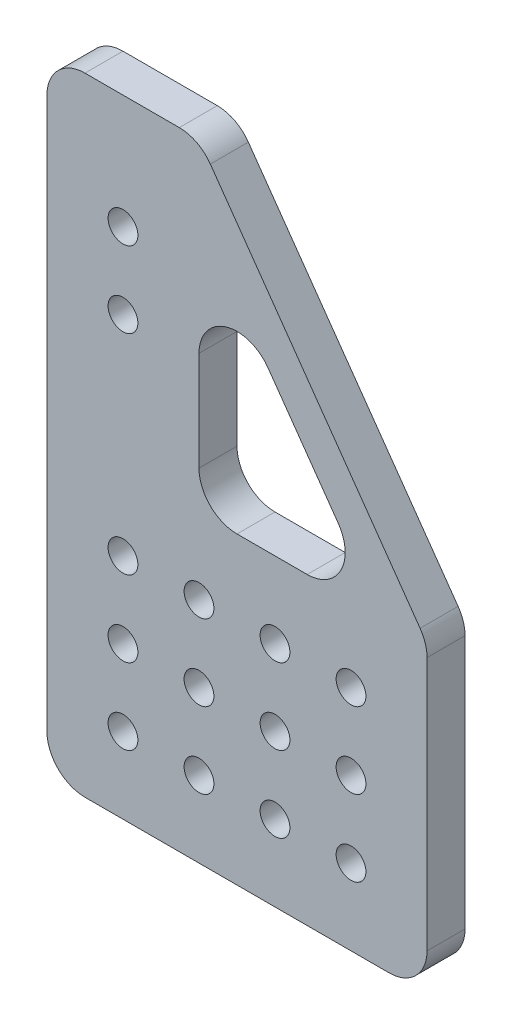
ISO-10303-21;
HEADER;
FILE_DESCRIPTION(('STEP AP214'),'2;1');
FILE_NAME('part.step','',(''),(''),'','','');
FILE_SCHEMA(('AUTOMOTIVE_DESIGN { 1 0 10303 214 1 1 1 1 }'));
ENDSEC;
DATA;
#1=APPLICATION_CONTEXT('core data for automotive mechanical design processes');
#2=APPLICATION_PROTOCOL_DEFINITION('international standard','automotive_design',2000,#1);
#3=PRODUCT_CONTEXT('',#1,'mechanical');
#4=PRODUCT('Part','Part','',(#3));
#5=PRODUCT_RELATED_PRODUCT_CATEGORY('part','',(#4));
#6=PRODUCT_DEFINITION_FORMATION('','',#4);
#7=PRODUCT_DEFINITION_CONTEXT('part definition',#1,'design');
#8=PRODUCT_DEFINITION('design','',#6,#7);
#9=PRODUCT_DEFINITION_SHAPE('','',#8);
#10=(LENGTH_UNIT() NAMED_UNIT(*) SI_UNIT(.MILLI.,.METRE.));
#11=(NAMED_UNIT(*) PLANE_ANGLE_UNIT() SI_UNIT($,.RADIAN.));
#12=(NAMED_UNIT(*) SI_UNIT($,.STERADIAN.) SOLID_ANGLE_UNIT());
#13=UNCERTAINTY_MEASURE_WITH_UNIT(LENGTH_MEASURE(1.E-05),#10,'distance_accuracy_value','');
#14=(GEOMETRIC_REPRESENTATION_CONTEXT(3) GLOBAL_UNCERTAINTY_ASSIGNED_CONTEXT((#13)) GLOBAL_UNIT_ASSIGNED_CONTEXT((#10,
#11,#12)) REPRESENTATION_CONTEXT('',''));
#15=CARTESIAN_POINT('',(0.,0.,0.));
#16=DIRECTION('',(0.,0.,1.));
#17=DIRECTION('',(1.,0.,0.));
#18=AXIS2_PLACEMENT_3D('',#15,#16,#17);
#19=CARTESIAN_POINT('',(50.8,38.1,3.175));
#20=DIRECTION('',(0.,0.,-1.));
#21=DIRECTION('',(-1.,0.,0.));
#22=AXIS2_PLACEMENT_3D('',#19,#20,#21);
#23=CYLINDRICAL_SURFACE('',#22,2.4892);
#24=CARTESIAN_POINT('',(50.8,38.1,3.175));
#25=DIRECTION('',(0.,0.,1.));
#26=DIRECTION('',(1.,0.,0.));
#27=AXIS2_PLACEMENT_3D('',#24,#25,#26);
#28=CIRCLE('',#27,2.4892);
#29=CARTESIAN_POINT('',(53.2892,38.1,3.175));
#30=VERTEX_POINT('',#29);
#31=EDGE_CURVE('E285',#30,#30,#28,.T.);
#32=ORIENTED_EDGE('',*,*,#31,.T.);
#33=EDGE_LOOP('',(#32));
#34=FACE_BOUND('',#33,.T.);
#35=CARTESIAN_POINT('',(50.8,38.1,-3.175));
#36=DIRECTION('',(0.,0.,1.));
#37=DIRECTION('',(1.,0.,0.));
#38=AXIS2_PLACEMENT_3D('',#35,#36,#37);
#39=CIRCLE('',#38,2.4892);
#40=CARTESIAN_POINT('',(53.2892,38.1,-3.175));
#41=VERTEX_POINT('',#40);
#42=EDGE_CURVE('E289',#41,#41,#39,.T.);
#43=ORIENTED_EDGE('',*,*,#42,.F.);
#44=EDGE_LOOP('',(#43));
#45=FACE_BOUND('',#44,.T.);
#46=ADVANCED_FACE('F38',(#34,#45),#23,.F.);
#47=CARTESIAN_POINT('',(38.1,38.1,3.175));
#48=DIRECTION('',(0.,0.,-1.));
#49=DIRECTION('',(-1.,0.,0.));
#50=AXIS2_PLACEMENT_3D('',#47,#48,#49);
#51=CYLINDRICAL_SURFACE('',#50,2.4892);
#52=CARTESIAN_POINT('',(38.1,38.1,3.175));
#53=DIRECTION('',(0.,0.,1.));
#54=DIRECTION('',(1.,0.,0.));
#55=AXIS2_PLACEMENT_3D('',#52,#53,#54);
#56=CIRCLE('',#55,2.4892);
#57=CARTESIAN_POINT('',(40.5892,38.1,3.175));
#58=VERTEX_POINT('',#57);
#59=EDGE_CURVE('E277',#58,#58,#56,.T.);
#60=ORIENTED_EDGE('',*,*,#59,.T.);
#61=EDGE_LOOP('',(#60));
#62=FACE_BOUND('',#61,.T.);
#63=CARTESIAN_POINT('',(38.1,38.1,-3.175));
#64=DIRECTION('',(0.,0.,1.));
#65=DIRECTION('',(1.,0.,0.));
#66=AXIS2_PLACEMENT_3D('',#63,#64,#65);
#67=CIRCLE('',#66,2.4892);
#68=CARTESIAN_POINT('',(40.5892,38.1,-3.175));
#69=VERTEX_POINT('',#68);
#70=EDGE_CURVE('E281',#69,#69,#67,.T.);
#71=ORIENTED_EDGE('',*,*,#70,.F.);
#72=EDGE_LOOP('',(#71));
#73=FACE_BOUND('',#72,.T.);
#74=ADVANCED_FACE('F496',(#62,#73),#51,.F.);
#75=CARTESIAN_POINT('',(25.4,38.1,3.175));
#76=DIRECTION('',(0.,0.,-1.));
#77=DIRECTION('',(-1.,0.,0.));
#78=AXIS2_PLACEMENT_3D('',#75,#76,#77);
#79=CYLINDRICAL_SURFACE('',#78,2.4892);
#80=CARTESIAN_POINT('',(25.4,38.1,3.175));
#81=DIRECTION('',(0.,0.,1.));
#82=DIRECTION('',(1.,0.,0.));
#83=AXIS2_PLACEMENT_3D('',#80,#81,#82);
#84=CIRCLE('',#83,2.4892);
#85=CARTESIAN_POINT('',(27.8892,38.1,3.175));
#86=VERTEX_POINT('',#85);
#87=EDGE_CURVE('E269',#86,#86,#84,.T.);
#88=ORIENTED_EDGE('',*,*,#87,.T.);
#89=EDGE_LOOP('',(#88));
#90=FACE_BOUND('',#89,.T.);
#91=CARTESIAN_POINT('',(25.4,38.1,-3.175));
#92=DIRECTION('',(0.,0.,1.));
#93=DIRECTION('',(1.,0.,0.));
#94=AXIS2_PLACEMENT_3D('',#91,#92,#93);
#95=CIRCLE('',#94,2.4892);
#96=CARTESIAN_POINT('',(27.8892,38.1,-3.175));
#97=VERTEX_POINT('',#96);
#98=EDGE_CURVE('E273',#97,#97,#95,.T.);
#99=ORIENTED_EDGE('',*,*,#98,.F.);
#100=EDGE_LOOP('',(#99));
#101=FACE_BOUND('',#100,.T.);
#102=ADVANCED_FACE('F502',(#90,#101),#79,.F.);
#103=CARTESIAN_POINT('',(12.7,38.1,3.175));
#104=DIRECTION('',(0.,0.,-1.));
#105=DIRECTION('',(-1.,0.,0.));
#106=AXIS2_PLACEMENT_3D('',#103,#104,#105);
#107=CYLINDRICAL_SURFACE('',#106,2.4892);
#108=CARTESIAN_POINT('',(12.7,38.1,3.175));
#109=DIRECTION('',(0.,0.,1.));
#110=DIRECTION('',(1.,0.,0.));
#111=AXIS2_PLACEMENT_3D('',#108,#109,#110);
#112=CIRCLE('',#111,2.4892);
#113=CARTESIAN_POINT('',(15.1892,38.1,3.175));
#114=VERTEX_POINT('',#113);
#115=EDGE_CURVE('E261',#114,#114,#112,.T.);
#116=ORIENTED_EDGE('',*,*,#115,.T.);
#117=EDGE_LOOP('',(#116));
#118=FACE_BOUND('',#117,.T.);
#119=CARTESIAN_POINT('',(12.7,38.1,-3.175));
#120=DIRECTION('',(0.,0.,1.));
#121=DIRECTION('',(1.,0.,0.));
#122=AXIS2_PLACEMENT_3D('',#119,#120,#121);
#123=CIRCLE('',#122,2.4892);
#124=CARTESIAN_POINT('',(15.1892,38.1,-3.175));
#125=VERTEX_POINT('',#124);
#126=EDGE_CURVE('E265',#125,#125,#123,.T.);
#127=ORIENTED_EDGE('',*,*,#126,.F.);
#128=EDGE_LOOP('',(#127));
#129=FACE_BOUND('',#128,.T.);
#130=ADVANCED_FACE('F509',(#118,#129),#107,.F.);
#131=CARTESIAN_POINT('',(50.8,25.4,3.175));
#132=DIRECTION('',(0.,0.,-1.));
#133=DIRECTION('',(-1.,0.,0.));
#134=AXIS2_PLACEMENT_3D('',#131,#132,#133);
#135=CYLINDRICAL_SURFACE('',#134,2.4892);
#136=CARTESIAN_POINT('',(50.8,25.4,3.175));
#137=DIRECTION('',(0.,0.,1.));
#138=DIRECTION('',(1.,0.,0.));
#139=AXIS2_PLACEMENT_3D('',#136,#137,#138);
#140=CIRCLE('',#139,2.4892);
#141=CARTESIAN_POINT('',(53.2892,25.4,3.175));
#142=VERTEX_POINT('',#141);
#143=EDGE_CURVE('E253',#142,#142,#140,.T.);
#144=ORIENTED_EDGE('',*,*,#143,.T.);
#145=EDGE_LOOP('',(#144));
#146=FACE_BOUND('',#145,.T.);
#147=CARTESIAN_POINT('',(50.8,25.4,-3.175));
#148=DIRECTION('',(0.,0.,1.));
#149=DIRECTION('',(1.,0.,0.));
#150=AXIS2_PLACEMENT_3D('',#147,#148,#149);
#151=CIRCLE('',#150,2.4892);
#152=CARTESIAN_POINT('',(53.2892,25.4,-3.175));
#153=VERTEX_POINT('',#152);
#154=EDGE_CURVE('E257',#153,#153,#151,.T.);
#155=ORIENTED_EDGE('',*,*,#154,.F.);
#156=EDGE_LOOP('',(#155));
#157=FACE_BOUND('',#156,.T.);
#158=ADVANCED_FACE('F513',(#146,#157),#135,.F.);
#159=CARTESIAN_POINT('',(38.1,25.4,3.175));
#160=DIRECTION('',(0.,0.,-1.));
#161=DIRECTION('',(-1.,0.,0.));
#162=AXIS2_PLACEMENT_3D('',#159,#160,#161);
#163=CYLINDRICAL_SURFACE('',#162,2.4892);
#164=CARTESIAN_POINT('',(38.1,25.4,3.175));
#165=DIRECTION('',(0.,0.,1.));
#166=DIRECTION('',(1.,0.,0.));
#167=AXIS2_PLACEMENT_3D('',#164,#165,#166);
#168=CIRCLE('',#167,2.4892);
#169=CARTESIAN_POINT('',(40.5892,25.4,3.175));
#170=VERTEX_POINT('',#169);
#171=EDGE_CURVE('E245',#170,#170,#168,.T.);
#172=ORIENTED_EDGE('',*,*,#171,.T.);
#173=EDGE_LOOP('',(#172));
#174=FACE_BOUND('',#173,.T.);
#175=CARTESIAN_POINT('',(38.1,25.4,-3.175));
#176=DIRECTION('',(0.,0.,1.));
#177=DIRECTION('',(1.,0.,0.));
#178=AXIS2_PLACEMENT_3D('',#175,#176,#177);
#179=CIRCLE('',#178,2.4892);
#180=CARTESIAN_POINT('',(40.5892,25.4,-3.175));
#181=VERTEX_POINT('',#180);
#182=EDGE_CURVE('E249',#181,#181,#179,.T.);
#183=ORIENTED_EDGE('',*,*,#182,.F.);
#184=EDGE_LOOP('',(#183));
#185=FACE_BOUND('',#184,.T.);
#186=ADVANCED_FACE('F517',(#174,#185),#163,.F.);
#187=CARTESIAN_POINT('',(25.4,25.4,3.175));
#188=DIRECTION('',(0.,0.,-1.));
#189=DIRECTION('',(-1.,0.,0.));
#190=AXIS2_PLACEMENT_3D('',#187,#188,#189);
#191=CYLINDRICAL_SURFACE('',#190,2.4892);
#192=CARTESIAN_POINT('',(25.4,25.4,3.175));
#193=DIRECTION('',(0.,0.,1.));
#194=DIRECTION('',(1.,0.,0.));
#195=AXIS2_PLACEMENT_3D('',#192,#193,#194);
#196=CIRCLE('',#195,2.4892);
#197=CARTESIAN_POINT('',(27.8892,25.4,3.175));
#198=VERTEX_POINT('',#197);
#199=EDGE_CURVE('E237',#198,#198,#196,.T.);
#200=ORIENTED_EDGE('',*,*,#199,.T.);
#201=EDGE_LOOP('',(#200));
#202=FACE_BOUND('',#201,.T.);
#203=CARTESIAN_POINT('',(25.4,25.4,-3.175));
#204=DIRECTION('',(0.,0.,1.));
#205=DIRECTION('',(1.,0.,0.));
#206=AXIS2_PLACEMENT_3D('',#203,#204,#205);
#207=CIRCLE('',#206,2.4892);
#208=CARTESIAN_POINT('',(27.8892,25.4,-3.175));
#209=VERTEX_POINT('',#208);
#210=EDGE_CURVE('E241',#209,#209,#207,.T.);
#211=ORIENTED_EDGE('',*,*,#210,.F.);
#212=EDGE_LOOP('',(#211));
#213=FACE_BOUND('',#212,.T.);
#214=ADVANCED_FACE('F521',(#202,#213),#191,.F.);
#215=CARTESIAN_POINT('',(12.7,25.4,3.175));
#216=DIRECTION('',(0.,0.,-1.));
#217=DIRECTION('',(-1.,0.,0.));
#218=AXIS2_PLACEMENT_3D('',#215,#216,#217);
#219=CYLINDRICAL_SURFACE('',#218,2.4892);
#220=CARTESIAN_POINT('',(12.7,25.4,3.175));
#221=DIRECTION('',(0.,0.,1.));
#222=DIRECTION('',(1.,0.,0.));
#223=AXIS2_PLACEMENT_3D('',#220,#221,#222);
#224=CIRCLE('',#223,2.4892);
#225=CARTESIAN_POINT('',(15.1892,25.4,3.175));
#226=VERTEX_POINT('',#225);
#227=EDGE_CURVE('E229',#226,#226,#224,.T.);
#228=ORIENTED_EDGE('',*,*,#227,.T.);
#229=EDGE_LOOP('',(#228));
#230=FACE_BOUND('',#229,.T.);
#231=CARTESIAN_POINT('',(12.7,25.4,-3.175));
#232=DIRECTION('',(0.,0.,1.));
#233=DIRECTION('',(1.,0.,0.));
#234=AXIS2_PLACEMENT_3D('',#231,#232,#233);
#235=CIRCLE('',#234,2.4892);
#236=CARTESIAN_POINT('',(15.1892,25.4,-3.175));
#237=VERTEX_POINT('',#236);
#238=EDGE_CURVE('E233',#237,#237,#235,.T.);
#239=ORIENTED_EDGE('',*,*,#238,.F.);
#240=EDGE_LOOP('',(#239));
#241=FACE_BOUND('',#240,.T.);
#242=ADVANCED_FACE('F525',(#230,#241),#219,.F.);
#243=CARTESIAN_POINT('',(50.8,12.7,3.175));
#244=DIRECTION('',(0.,0.,-1.));
#245=DIRECTION('',(-1.,0.,0.));
#246=AXIS2_PLACEMENT_3D('',#243,#244,#245);
#247=CYLINDRICAL_SURFACE('',#246,2.4892);
#248=CARTESIAN_POINT('',(50.8,12.7,3.175));
#249=DIRECTION('',(0.,0.,1.));
#250=DIRECTION('',(1.,0.,0.));
#251=AXIS2_PLACEMENT_3D('',#248,#249,#250);
#252=CIRCLE('',#251,2.4892);
#253=CARTESIAN_POINT('',(53.2892,12.7,3.175));
#254=VERTEX_POINT('',#253);
#255=EDGE_CURVE('E221',#254,#254,#252,.T.);
#256=ORIENTED_EDGE('',*,*,#255,.T.);
#257=EDGE_LOOP('',(#256));
#258=FACE_BOUND('',#257,.T.);
#259=CARTESIAN_POINT('',(50.8,12.7,-3.175));
#260=DIRECTION('',(0.,0.,1.));
#261=DIRECTION('',(1.,0.,0.));
#262=AXIS2_PLACEMENT_3D('',#259,#260,#261);
#263=CIRCLE('',#262,2.4892);
#264=CARTESIAN_POINT('',(53.2892,12.7,-3.175));
#265=VERTEX_POINT('',#264);
#266=EDGE_CURVE('E225',#265,#265,#263,.T.);
#267=ORIENTED_EDGE('',*,*,#266,.F.);
#268=EDGE_LOOP('',(#267));
#269=FACE_BOUND('',#268,.T.);
#270=ADVANCED_FACE('F529',(#258,#269),#247,.F.);
#271=CARTESIAN_POINT('',(38.1,12.7,3.175));
#272=DIRECTION('',(0.,0.,-1.));
#273=DIRECTION('',(-1.,0.,0.));
#274=AXIS2_PLACEMENT_3D('',#271,#272,#273);
#275=CYLINDRICAL_SURFACE('',#274,2.4892);
#276=CARTESIAN_POINT('',(38.1,12.7,3.175));
#277=DIRECTION('',(0.,0.,1.));
#278=DIRECTION('',(1.,0.,0.));
#279=AXIS2_PLACEMENT_3D('',#276,#277,#278);
#280=CIRCLE('',#279,2.4892);
#281=CARTESIAN_POINT('',(40.5892,12.7,3.175));
#282=VERTEX_POINT('',#281);
#283=EDGE_CURVE('E213',#282,#282,#280,.T.);
#284=ORIENTED_EDGE('',*,*,#283,.T.);
#285=EDGE_LOOP('',(#284));
#286=FACE_BOUND('',#285,.T.);
#287=CARTESIAN_POINT('',(38.1,12.7,-3.175));
#288=DIRECTION('',(0.,0.,1.));
#289=DIRECTION('',(1.,0.,0.));
#290=AXIS2_PLACEMENT_3D('',#287,#288,#289);
#291=CIRCLE('',#290,2.4892);
#292=CARTESIAN_POINT('',(40.5892,12.7,-3.175));
#293=VERTEX_POINT('',#292);
#294=EDGE_CURVE('E217',#293,#293,#291,.T.);
#295=ORIENTED_EDGE('',*,*,#294,.F.);
#296=EDGE_LOOP('',(#295));
#297=FACE_BOUND('',#296,.T.);
#298=ADVANCED_FACE('F533',(#286,#297),#275,.F.);
#299=CARTESIAN_POINT('',(25.4,12.7,3.175));
#300=DIRECTION('',(0.,0.,-1.));
#301=DIRECTION('',(-1.,0.,0.));
#302=AXIS2_PLACEMENT_3D('',#299,#300,#301);
#303=CYLINDRICAL_SURFACE('',#302,2.4892);
#304=CARTESIAN_POINT('',(25.4,12.7,3.175));
#305=DIRECTION('',(0.,0.,1.));
#306=DIRECTION('',(1.,0.,0.));
#307=AXIS2_PLACEMENT_3D('',#304,#305,#306);
#308=CIRCLE('',#307,2.4892);
#309=CARTESIAN_POINT('',(27.8892,12.7,3.175));
#310=VERTEX_POINT('',#309);
#311=EDGE_CURVE('E204',#310,#310,#308,.T.);
#312=ORIENTED_EDGE('',*,*,#311,.T.);
#313=EDGE_LOOP('',(#312));
#314=FACE_BOUND('',#313,.T.);
#315=CARTESIAN_POINT('',(25.4,12.7,-3.175));
#316=DIRECTION('',(0.,0.,1.));
#317=DIRECTION('',(1.,0.,0.));
#318=AXIS2_PLACEMENT_3D('',#315,#316,#317);
#319=CIRCLE('',#318,2.4892);
#320=CARTESIAN_POINT('',(27.8892,12.7,-3.175));
#321=VERTEX_POINT('',#320);
#322=EDGE_CURVE('E208',#321,#321,#319,.T.);
#323=ORIENTED_EDGE('',*,*,#322,.F.);
#324=EDGE_LOOP('',(#323));
#325=FACE_BOUND('',#324,.T.);
#326=ADVANCED_FACE('F537',(#314,#325),#303,.F.);
#327=CARTESIAN_POINT('',(0.,0.,3.175));
#328=DIRECTION('',(0.,0.,-1.));
#329=DIRECTION('',(-1.,0.,0.));
#330=AXIS2_PLACEMENT_3D('',#327,#328,#329);
#331=PLANE('',#330);
#332=DIRECTION('',(-0.576683197598655,0.816967863264761,0.));
#333=VECTOR('',#332,1.);
#334=CARTESIAN_POINT('',(55.7273564413854,50.8,3.175));
#335=LINE('',#334,#333);
#336=CARTESIAN_POINT('',(48.6601058733255,60.8119383047515,3.175));
#337=VERTEX_POINT('',#336);
#338=CARTESIAN_POINT('',(36.9377459317312,77.4186148886767,3.175));
#339=VERTEX_POINT('',#338);
#340=EDGE_CURVE('E398',#337,#339,#335,.T.);
#341=ORIENTED_EDGE('',*,*,#340,.F.);
#342=CARTESIAN_POINT('',(43.4723599415943,57.15,3.175));
#343=DIRECTION('',(0.,0.,-1.));
#344=DIRECTION('',(-1.,0.,0.));
#345=AXIS2_PLACEMENT_3D('',#342,#343,#344);
#346=CIRCLE('',#345,6.35);
#347=CARTESIAN_POINT('',(43.4723599415943,50.8,3.175));
#348=VERTEX_POINT('',#347);
#349=EDGE_CURVE('E371',#337,#348,#346,.T.);
#350=ORIENTED_EDGE('',*,*,#349,.T.);
#351=DIRECTION('',(1.,0.,0.));
#352=VECTOR('',#351,1.);
#353=CARTESIAN_POINT('',(25.4,50.8,3.175));
#354=LINE('',#353,#352);
#355=CARTESIAN_POINT('',(31.75,50.8,3.175));
#356=VERTEX_POINT('',#355);
#357=EDGE_CURVE('E387',#356,#348,#354,.T.);
#358=ORIENTED_EDGE('',*,*,#357,.F.);
#359=CARTESIAN_POINT('',(31.75,57.15,3.175));
#360=DIRECTION('',(0.,0.,-1.));
#361=DIRECTION('',(-1.,0.,0.));
#362=AXIS2_PLACEMENT_3D('',#359,#360,#361);
#363=CIRCLE('',#362,6.35);
#364=CARTESIAN_POINT('',(25.4,57.15,3.175));
#365=VERTEX_POINT('',#364);
#366=EDGE_CURVE('E47',#356,#365,#363,.T.);
#367=ORIENTED_EDGE('',*,*,#366,.T.);
#368=DIRECTION('',(0.,-1.,0.));
#369=VECTOR('',#368,1.);
#370=CARTESIAN_POINT('',(25.4,93.7637549586293,3.175));
#371=LINE('',#370,#369);
#372=CARTESIAN_POINT('',(25.4,73.7566765839252,3.175));
#373=VERTEX_POINT('',#372);
#374=EDGE_CURVE('E385',#373,#365,#371,.T.);
#375=ORIENTED_EDGE('',*,*,#374,.F.);
#376=CARTESIAN_POINT('',(31.75,73.7566765839252,3.175));
#377=DIRECTION('',(0.,0.,-1.));
#378=DIRECTION('',(-1.,0.,0.));
#379=AXIS2_PLACEMENT_3D('',#376,#377,#378);
#380=CIRCLE('',#379,6.35);
#381=EDGE_CURVE('E365',#373,#339,#380,.T.);
#382=ORIENTED_EDGE('',*,*,#381,.T.);
#383=EDGE_LOOP('',(#341,#350,#358,#367,#375,#382));
#384=FACE_BOUND('',#383,.T.);
#385=ORIENTED_EDGE('',*,*,#31,.F.);
#386=EDGE_LOOP('',(#385));
#387=FACE_BOUND('',#386,.T.);
#388=ORIENTED_EDGE('',*,*,#59,.F.);
#389=EDGE_LOOP('',(#388));
#390=FACE_BOUND('',#389,.T.);
#391=ORIENTED_EDGE('',*,*,#87,.F.);
#392=EDGE_LOOP('',(#391));
#393=FACE_BOUND('',#392,.T.);
#394=ORIENTED_EDGE('',*,*,#115,.F.);
#395=EDGE_LOOP('',(#394));
#396=FACE_BOUND('',#395,.T.);
#397=ORIENTED_EDGE('',*,*,#143,.F.);
#398=EDGE_LOOP('',(#397));
#399=FACE_BOUND('',#398,.T.);
#400=ORIENTED_EDGE('',*,*,#171,.F.);
#401=EDGE_LOOP('',(#400));
#402=FACE_BOUND('',#401,.T.);
#403=ORIENTED_EDGE('',*,*,#199,.F.);
#404=EDGE_LOOP('',(#403));
#405=FACE_BOUND('',#404,.T.);
#406=ORIENTED_EDGE('',*,*,#227,.F.);
#407=EDGE_LOOP('',(#406));
#408=FACE_BOUND('',#407,.T.);
#409=ORIENTED_EDGE('',*,*,#255,.F.);
#410=EDGE_LOOP('',(#409));
#411=FACE_BOUND('',#410,.T.);
#412=ORIENTED_EDGE('',*,*,#283,.F.);
#413=EDGE_LOOP('',(#412));
#414=FACE_BOUND('',#413,.T.);
#415=ORIENTED_EDGE('',*,*,#311,.F.);
#416=EDGE_LOOP('',(#415));
#417=FACE_BOUND('',#416,.T.);
#418=DIRECTION('',(1.,0.,0.));
#419=VECTOR('',#418,1.);
#420=CARTESIAN_POINT('',(63.5,0.,3.175));
#421=LINE('',#420,#419);
#422=CARTESIAN_POINT('',(6.35,0.,3.175));
#423=VERTEX_POINT('',#422);
#424=CARTESIAN_POINT('',(57.15,0.,3.175));
#425=VERTEX_POINT('',#424);
#426=EDGE_CURVE('E203',#423,#425,#421,.T.);
#427=ORIENTED_EDGE('',*,*,#426,.T.);
#428=CARTESIAN_POINT('',(57.15,6.35,3.175));
#429=DIRECTION('',(0.,0.,-1.));
#430=DIRECTION('',(-1.,0.,0.));
#431=AXIS2_PLACEMENT_3D('',#428,#429,#430);
#432=CIRCLE('',#431,6.35);
#433=CARTESIAN_POINT('',(63.5,6.35,3.175));
#434=VERTEX_POINT('',#433);
#435=EDGE_CURVE('E321',#425,#434,#432,.F.);
#436=ORIENTED_EDGE('',*,*,#435,.T.);
#437=DIRECTION('',(0.,1.,0.));
#438=VECTOR('',#437,1.);
#439=CARTESIAN_POINT('',(63.5,50.8,3.175));
#440=LINE('',#439,#438);
#441=CARTESIAN_POINT('',(63.5,48.7845882919626,3.175));
#442=VERTEX_POINT('',#441);
#443=EDGE_CURVE('E174',#434,#442,#440,.T.);
#444=ORIENTED_EDGE('',*,*,#443,.T.);
#445=CARTESIAN_POINT('',(57.15,48.7845882919626,3.175));
#446=DIRECTION('',(0.,0.,-1.));
#447=DIRECTION('',(-1.,0.,0.));
#448=AXIS2_PLACEMENT_3D('',#445,#446,#447);
#449=CIRCLE('',#448,6.35);
#450=CARTESIAN_POINT('',(62.3377459317312,52.4465265967141,3.175));
#451=VERTEX_POINT('',#450);
#452=EDGE_CURVE('E318',#442,#451,#449,.F.);
#453=ORIENTED_EDGE('',*,*,#452,.T.);
#454=DIRECTION('',(-0.576683197598655,0.816967863264762,0.));
#455=VECTOR('',#454,1.);
#456=CARTESIAN_POINT('',(25.4,104.775,3.175));
#457=LINE('',#456,#455);
#458=CARTESIAN_POINT('',(27.2974553142931,102.086938304751,3.175));
#459=VERTEX_POINT('',#458);
#460=EDGE_CURVE('E449',#451,#459,#457,.T.);
#461=ORIENTED_EDGE('',*,*,#460,.T.);
#462=CARTESIAN_POINT('',(22.1097093825618,98.425,3.175));
#463=DIRECTION('',(0.,0.,-1.));
#464=DIRECTION('',(-1.,0.,0.));
#465=AXIS2_PLACEMENT_3D('',#462,#463,#464);
#466=CIRCLE('',#465,6.35);
#467=CARTESIAN_POINT('',(22.1097093825618,104.775,3.175));
#468=VERTEX_POINT('',#467);
#469=EDGE_CURVE('E315',#459,#468,#466,.F.);
#470=ORIENTED_EDGE('',*,*,#469,.T.);
#471=DIRECTION('',(-1.,0.,0.));
#472=VECTOR('',#471,1.);
#473=CARTESIAN_POINT('',(0.,104.775,3.175));
#474=LINE('',#473,#472);
#475=CARTESIAN_POINT('',(6.35,104.775,3.175));
#476=VERTEX_POINT('',#475);
#477=EDGE_CURVE('E453',#468,#476,#474,.T.);
#478=ORIENTED_EDGE('',*,*,#477,.T.);
#479=CARTESIAN_POINT('',(6.35,98.425,3.175));
#480=DIRECTION('',(0.,0.,-1.));
#481=DIRECTION('',(-1.,0.,0.));
#482=AXIS2_PLACEMENT_3D('',#479,#480,#481);
#483=CIRCLE('',#482,6.35);
#484=CARTESIAN_POINT('',(0.,98.425,3.175));
#485=VERTEX_POINT('',#484);
#486=EDGE_CURVE('E61',#476,#485,#483,.F.);
#487=ORIENTED_EDGE('',*,*,#486,.T.);
#488=DIRECTION('',(0.,-1.,0.));
#489=VECTOR('',#488,1.);
#490=CARTESIAN_POINT('',(0.,0.,3.175));
#491=LINE('',#490,#489);
#492=CARTESIAN_POINT('',(0.,6.35,3.175));
#493=VERTEX_POINT('',#492);
#494=EDGE_CURVE('E209',#485,#493,#491,.T.);
#495=ORIENTED_EDGE('',*,*,#494,.T.);
#496=CARTESIAN_POINT('',(6.35,6.35,3.175));
#497=DIRECTION('',(0.,0.,-1.));
#498=DIRECTION('',(-1.,0.,0.));
#499=AXIS2_PLACEMENT_3D('',#496,#497,#498);
#500=CIRCLE('',#499,6.35);
#501=EDGE_CURVE('E310',#493,#423,#500,.F.);
#502=ORIENTED_EDGE('',*,*,#501,.T.);
#503=EDGE_LOOP('',(#427,#436,#444,#453,#461,#470,#478,#487,#495,#502));
#504=FACE_BOUND('',#503,.T.);
#505=CARTESIAN_POINT('',(12.7,85.725,3.175));
#506=DIRECTION('',(0.,0.,1.));
#507=DIRECTION('',(1.,0.,0.));
#508=AXIS2_PLACEMENT_3D('',#505,#506,#507);
#509=CIRCLE('',#508,2.4892);
#510=CARTESIAN_POINT('',(15.1892,85.725,3.175));
#511=VERTEX_POINT('',#510);
#512=EDGE_CURVE('E193',#511,#511,#509,.T.);
#513=ORIENTED_EDGE('',*,*,#512,.F.);
#514=EDGE_LOOP('',(#513));
#515=FACE_BOUND('',#514,.T.);
#516=CARTESIAN_POINT('',(12.7,73.025,3.175));
#517=DIRECTION('',(0.,0.,1.));
#518=DIRECTION('',(1.,0.,0.));
#519=AXIS2_PLACEMENT_3D('',#516,#517,#518);
#520=CIRCLE('',#519,2.4892);
#521=CARTESIAN_POINT('',(15.1892,73.025,3.175));
#522=VERTEX_POINT('',#521);
#523=EDGE_CURVE('E431',#522,#522,#520,.T.);
#524=ORIENTED_EDGE('',*,*,#523,.F.);
#525=EDGE_LOOP('',(#524));
#526=FACE_BOUND('',#525,.T.);
#527=CARTESIAN_POINT('',(12.7,12.7,3.175));
#528=DIRECTION('',(0.,0.,1.));
#529=DIRECTION('',(1.,0.,0.));
#530=AXIS2_PLACEMENT_3D('',#527,#528,#529);
#531=CIRCLE('',#530,2.4892);
#532=CARTESIAN_POINT('',(15.1892,12.7,3.175));
#533=VERTEX_POINT('',#532);
#534=EDGE_CURVE('E424',#533,#533,#531,.T.);
#535=ORIENTED_EDGE('',*,*,#534,.F.);
#536=EDGE_LOOP('',(#535));
#537=FACE_BOUND('',#536,.T.);
#538=ADVANCED_FACE('F383',(#384,#387,#390,#393,#396,#399,#402,#405,#408,#411,#414,#417,#504,
#515,#526,#537),#331,.F.);
#539=CARTESIAN_POINT('',(0.,0.,-3.175));
#540=DIRECTION('',(0.,0.,-1.));
#541=DIRECTION('',(-1.,0.,0.));
#542=AXIS2_PLACEMENT_3D('',#539,#540,#541);
#543=PLANE('',#542);
#544=DIRECTION('',(0.,-1.,0.));
#545=VECTOR('',#544,1.);
#546=CARTESIAN_POINT('',(25.4,93.7637549586293,-3.175));
#547=LINE('',#546,#545);
#548=CARTESIAN_POINT('',(25.4,73.7566765839252,-3.175));
#549=VERTEX_POINT('',#548);
#550=CARTESIAN_POINT('',(25.4,57.15,-3.175));
#551=VERTEX_POINT('',#550);
#552=EDGE_CURVE('E406',#549,#551,#547,.T.);
#553=ORIENTED_EDGE('',*,*,#552,.T.);
#554=CARTESIAN_POINT('',(31.75,57.15,-3.175));
#555=DIRECTION('',(0.,0.,-1.));
#556=DIRECTION('',(-1.,0.,0.));
#557=AXIS2_PLACEMENT_3D('',#554,#555,#556);
#558=CIRCLE('',#557,6.35);
#559=CARTESIAN_POINT('',(31.75,50.8,-3.175));
#560=VERTEX_POINT('',#559);
#561=EDGE_CURVE('E11',#551,#560,#558,.F.);
#562=ORIENTED_EDGE('',*,*,#561,.T.);
#563=DIRECTION('',(1.,0.,0.));
#564=VECTOR('',#563,1.);
#565=CARTESIAN_POINT('',(25.4,50.8,-3.175));
#566=LINE('',#565,#564);
#567=CARTESIAN_POINT('',(43.4723599415943,50.8,-3.175));
#568=VERTEX_POINT('',#567);
#569=EDGE_CURVE('E397',#560,#568,#566,.T.);
#570=ORIENTED_EDGE('',*,*,#569,.T.);
#571=CARTESIAN_POINT('',(43.4723599415943,57.15,-3.175));
#572=DIRECTION('',(0.,0.,-1.));
#573=DIRECTION('',(-1.,0.,0.));
#574=AXIS2_PLACEMENT_3D('',#571,#572,#573);
#575=CIRCLE('',#574,6.35);
#576=CARTESIAN_POINT('',(48.6601058733255,60.8119383047515,-3.175));
#577=VERTEX_POINT('',#576);
#578=EDGE_CURVE('E374',#568,#577,#575,.F.);
#579=ORIENTED_EDGE('',*,*,#578,.T.);
#580=DIRECTION('',(-0.576683197598655,0.816967863264761,0.));
#581=VECTOR('',#580,1.);
#582=CARTESIAN_POINT('',(55.7273564413854,50.8,-3.175));
#583=LINE('',#582,#581);
#584=CARTESIAN_POINT('',(36.9377459317312,77.4186148886767,-3.175));
#585=VERTEX_POINT('',#584);
#586=EDGE_CURVE('E410',#577,#585,#583,.T.);
#587=ORIENTED_EDGE('',*,*,#586,.T.);
#588=CARTESIAN_POINT('',(31.75,73.7566765839252,-3.175));
#589=DIRECTION('',(0.,0.,-1.));
#590=DIRECTION('',(-1.,0.,0.));
#591=AXIS2_PLACEMENT_3D('',#588,#589,#590);
#592=CIRCLE('',#591,6.35);
#593=EDGE_CURVE('E368',#585,#549,#592,.F.);
#594=ORIENTED_EDGE('',*,*,#593,.T.);
#595=EDGE_LOOP('',(#553,#562,#570,#579,#587,#594));
#596=FACE_BOUND('',#595,.T.);
#597=ORIENTED_EDGE('',*,*,#42,.T.);
#598=EDGE_LOOP('',(#597));
#599=FACE_BOUND('',#598,.T.);
#600=ORIENTED_EDGE('',*,*,#70,.T.);
#601=EDGE_LOOP('',(#600));
#602=FACE_BOUND('',#601,.T.);
#603=ORIENTED_EDGE('',*,*,#98,.T.);
#604=EDGE_LOOP('',(#603));
#605=FACE_BOUND('',#604,.T.);
#606=ORIENTED_EDGE('',*,*,#126,.T.);
#607=EDGE_LOOP('',(#606));
#608=FACE_BOUND('',#607,.T.);
#609=ORIENTED_EDGE('',*,*,#154,.T.);
#610=EDGE_LOOP('',(#609));
#611=FACE_BOUND('',#610,.T.);
#612=ORIENTED_EDGE('',*,*,#182,.T.);
#613=EDGE_LOOP('',(#612));
#614=FACE_BOUND('',#613,.T.);
#615=ORIENTED_EDGE('',*,*,#210,.T.);
#616=EDGE_LOOP('',(#615));
#617=FACE_BOUND('',#616,.T.);
#618=ORIENTED_EDGE('',*,*,#238,.T.);
#619=EDGE_LOOP('',(#618));
#620=FACE_BOUND('',#619,.T.);
#621=ORIENTED_EDGE('',*,*,#266,.T.);
#622=EDGE_LOOP('',(#621));
#623=FACE_BOUND('',#622,.T.);
#624=ORIENTED_EDGE('',*,*,#294,.T.);
#625=EDGE_LOOP('',(#624));
#626=FACE_BOUND('',#625,.T.);
#627=ORIENTED_EDGE('',*,*,#322,.T.);
#628=EDGE_LOOP('',(#627));
#629=FACE_BOUND('',#628,.T.);
#630=CARTESIAN_POINT('',(12.7,73.025,-3.175));
#631=DIRECTION('',(0.,0.,1.));
#632=DIRECTION('',(1.,0.,0.));
#633=AXIS2_PLACEMENT_3D('',#630,#631,#632);
#634=CIRCLE('',#633,2.4892);
#635=CARTESIAN_POINT('',(15.1892,73.025,-3.175));
#636=VERTEX_POINT('',#635);
#637=EDGE_CURVE('E428',#636,#636,#634,.T.);
#638=ORIENTED_EDGE('',*,*,#637,.T.);
#639=EDGE_LOOP('',(#638));
#640=FACE_BOUND('',#639,.T.);
#641=DIRECTION('',(0.,1.,0.));
#642=VECTOR('',#641,1.);
#643=CARTESIAN_POINT('',(63.5,50.8,-3.175));
#644=LINE('',#643,#642);
#645=CARTESIAN_POINT('',(63.5,6.35,-3.175));
#646=VERTEX_POINT('',#645);
#647=CARTESIAN_POINT('',(63.5,48.7845882919626,-3.175));
#648=VERTEX_POINT('',#647);
#649=EDGE_CURVE('E171',#646,#648,#644,.T.);
#650=ORIENTED_EDGE('',*,*,#649,.F.);
#651=CARTESIAN_POINT('',(57.15,6.35,-3.175));
#652=DIRECTION('',(0.,0.,-1.));
#653=DIRECTION('',(-1.,0.,0.));
#654=AXIS2_PLACEMENT_3D('',#651,#652,#653);
#655=CIRCLE('',#654,6.35);
#656=CARTESIAN_POINT('',(57.15,0.,-3.175));
#657=VERTEX_POINT('',#656);
#658=EDGE_CURVE('E153',#646,#657,#655,.T.);
#659=ORIENTED_EDGE('',*,*,#658,.T.);
#660=DIRECTION('',(1.,0.,0.));
#661=VECTOR('',#660,1.);
#662=CARTESIAN_POINT('',(63.5,0.,-3.175));
#663=LINE('',#662,#661);
#664=CARTESIAN_POINT('',(6.35,0.,-3.175));
#665=VERTEX_POINT('',#664);
#666=EDGE_CURVE('E184',#665,#657,#663,.T.);
#667=ORIENTED_EDGE('',*,*,#666,.F.);
#668=CARTESIAN_POINT('',(6.35,6.35,-3.175));
#669=DIRECTION('',(0.,0.,-1.));
#670=DIRECTION('',(-1.,0.,0.));
#671=AXIS2_PLACEMENT_3D('',#668,#669,#670);
#672=CIRCLE('',#671,6.35);
#673=CARTESIAN_POINT('',(0.,6.35,-3.175));
#674=VERTEX_POINT('',#673);
#675=EDGE_CURVE('E176',#665,#674,#672,.T.);
#676=ORIENTED_EDGE('',*,*,#675,.T.);
#677=DIRECTION('',(0.,-1.,0.));
#678=VECTOR('',#677,1.);
#679=CARTESIAN_POINT('',(0.,0.,-3.175));
#680=LINE('',#679,#678);
#681=CARTESIAN_POINT('',(0.,98.425,-3.175));
#682=VERTEX_POINT('',#681);
#683=EDGE_CURVE('E200',#682,#674,#680,.T.);
#684=ORIENTED_EDGE('',*,*,#683,.F.);
#685=CARTESIAN_POINT('',(6.35,98.425,-3.175));
#686=DIRECTION('',(0.,0.,-1.));
#687=DIRECTION('',(-1.,0.,0.));
#688=AXIS2_PLACEMENT_3D('',#685,#686,#687);
#689=CIRCLE('',#688,6.35);
#690=CARTESIAN_POINT('',(6.35,104.775,-3.175));
#691=VERTEX_POINT('',#690);
#692=EDGE_CURVE('E297',#682,#691,#689,.T.);
#693=ORIENTED_EDGE('',*,*,#692,.T.);
#694=DIRECTION('',(-1.,0.,0.));
#695=VECTOR('',#694,1.);
#696=CARTESIAN_POINT('',(0.,104.775,-3.175));
#697=LINE('',#696,#695);
#698=CARTESIAN_POINT('',(22.1097093825618,104.775,-3.175));
#699=VERTEX_POINT('',#698);
#700=EDGE_CURVE('E190',#699,#691,#697,.T.);
#701=ORIENTED_EDGE('',*,*,#700,.F.);
#702=CARTESIAN_POINT('',(22.1097093825618,98.425,-3.175));
#703=DIRECTION('',(0.,0.,-1.));
#704=DIRECTION('',(-1.,0.,0.));
#705=AXIS2_PLACEMENT_3D('',#702,#703,#704);
#706=CIRCLE('',#705,6.35);
#707=CARTESIAN_POINT('',(27.2974553142931,102.086938304751,-3.175));
#708=VERTEX_POINT('',#707);
#709=EDGE_CURVE('E300',#699,#708,#706,.T.);
#710=ORIENTED_EDGE('',*,*,#709,.T.);
#711=DIRECTION('',(-0.576683197598655,0.816967863264762,0.));
#712=VECTOR('',#711,1.);
#713=CARTESIAN_POINT('',(25.4,104.775,-3.175));
#714=LINE('',#713,#712);
#715=CARTESIAN_POINT('',(62.3377459317312,52.4465265967141,-3.175));
#716=VERTEX_POINT('',#715);
#717=EDGE_CURVE('E183',#716,#708,#714,.T.);
#718=ORIENTED_EDGE('',*,*,#717,.F.);
#719=CARTESIAN_POINT('',(57.15,48.7845882919626,-3.175));
#720=DIRECTION('',(0.,0.,-1.));
#721=DIRECTION('',(-1.,0.,0.));
#722=AXIS2_PLACEMENT_3D('',#719,#720,#721);
#723=CIRCLE('',#722,6.35);
#724=EDGE_CURVE('E165',#716,#648,#723,.T.);
#725=ORIENTED_EDGE('',*,*,#724,.T.);
#726=EDGE_LOOP('',(#650,#659,#667,#676,#684,#693,#701,#710,#718,#725));
#727=FACE_BOUND('',#726,.T.);
#728=CARTESIAN_POINT('',(12.7,85.725,-3.175));
#729=DIRECTION('',(0.,0.,1.));
#730=DIRECTION('',(1.,0.,0.));
#731=AXIS2_PLACEMENT_3D('',#728,#729,#730);
#732=CIRCLE('',#731,2.4892);
#733=CARTESIAN_POINT('',(15.1892,85.725,-3.175));
#734=VERTEX_POINT('',#733);
#735=EDGE_CURVE('E435',#734,#734,#732,.T.);
#736=ORIENTED_EDGE('',*,*,#735,.T.);
#737=EDGE_LOOP('',(#736));
#738=FACE_BOUND('',#737,.T.);
#739=CARTESIAN_POINT('',(12.7,12.7,-3.175));
#740=DIRECTION('',(0.,0.,1.));
#741=DIRECTION('',(1.,0.,0.));
#742=AXIS2_PLACEMENT_3D('',#739,#740,#741);
#743=CIRCLE('',#742,2.4892);
#744=CARTESIAN_POINT('',(15.1892,12.7,-3.175));
#745=VERTEX_POINT('',#744);
#746=EDGE_CURVE('E418',#745,#745,#743,.T.);
#747=ORIENTED_EDGE('',*,*,#746,.T.);
#748=EDGE_LOOP('',(#747));
#749=FACE_BOUND('',#748,.T.);
#750=ADVANCED_FACE('F179',(#596,#599,#602,#605,#608,#611,#614,#617,#620,#623,#626,#629,#640,
#727,#738,#749),#543,.T.);
#751=CARTESIAN_POINT('',(63.5,0.,3.175));
#752=DIRECTION('',(0.,1.,0.));
#753=DIRECTION('',(-1.,0.,0.));
#754=AXIS2_PLACEMENT_3D('',#751,#752,#753);
#755=PLANE('',#754);
#756=ORIENTED_EDGE('',*,*,#666,.T.);
#757=DIRECTION('',(0.,0.,-1.));
#758=VECTOR('',#757,1.);
#759=CARTESIAN_POINT('',(57.15,0.,3.175));
#760=LINE('',#759,#758);
#761=EDGE_CURVE('E158',#657,#425,#760,.F.);
#762=ORIENTED_EDGE('',*,*,#761,.T.);
#763=ORIENTED_EDGE('',*,*,#426,.F.);
#764=DIRECTION('',(0.,0.,-1.));
#765=VECTOR('',#764,1.);
#766=CARTESIAN_POINT('',(6.35,0.,3.175));
#767=LINE('',#766,#765);
#768=EDGE_CURVE('E164',#423,#665,#767,.T.);
#769=ORIENTED_EDGE('',*,*,#768,.T.);
#770=EDGE_LOOP('',(#756,#762,#763,#769));
#771=FACE_BOUND('',#770,.T.);
#772=ADVANCED_FACE('F464',(#771),#755,.F.);
#773=CARTESIAN_POINT('',(63.5,50.8,3.175));
#774=DIRECTION('',(-1.,0.,0.));
#775=DIRECTION('',(0.,0.,1.));
#776=AXIS2_PLACEMENT_3D('',#773,#774,#775);
#777=PLANE('',#776);
#778=ORIENTED_EDGE('',*,*,#443,.F.);
#779=DIRECTION('',(0.,0.,-1.));
#780=VECTOR('',#779,1.);
#781=CARTESIAN_POINT('',(63.5,6.35,3.175));
#782=LINE('',#781,#780);
#783=EDGE_CURVE('E157',#434,#646,#782,.T.);
#784=ORIENTED_EDGE('',*,*,#783,.T.);
#785=ORIENTED_EDGE('',*,*,#649,.T.);
#786=DIRECTION('',(0.,0.,-1.));
#787=VECTOR('',#786,1.);
#788=CARTESIAN_POINT('',(63.5,48.7845882919626,3.175));
#789=LINE('',#788,#787);
#790=EDGE_CURVE('E177',#648,#442,#789,.F.);
#791=ORIENTED_EDGE('',*,*,#790,.T.);
#792=EDGE_LOOP('',(#778,#784,#785,#791));
#793=FACE_BOUND('',#792,.T.);
#794=ADVANCED_FACE('F170',(#793),#777,.F.);
#795=CARTESIAN_POINT('',(25.4,104.775,3.175));
#796=DIRECTION('',(-0.816967863264762,-0.576683197598655,0.));
#797=DIRECTION('',(0.576683197598655,-0.816967863264762,0.));
#798=AXIS2_PLACEMENT_3D('',#795,#796,#797);
#799=PLANE('',#798);
#800=ORIENTED_EDGE('',*,*,#460,.F.);
#801=DIRECTION('',(0.,0.,-1.));
#802=VECTOR('',#801,1.);
#803=CARTESIAN_POINT('',(62.3377459317312,52.4465265967141,3.175));
#804=LINE('',#803,#802);
#805=EDGE_CURVE('E327',#451,#716,#804,.T.);
#806=ORIENTED_EDGE('',*,*,#805,.T.);
#807=ORIENTED_EDGE('',*,*,#717,.T.);
#808=DIRECTION('',(0.,0.,-1.));
#809=VECTOR('',#808,1.);
#810=CARTESIAN_POINT('',(27.2974553142931,102.086938304751,3.175));
#811=LINE('',#810,#809);
#812=EDGE_CURVE('E324',#708,#459,#811,.F.);
#813=ORIENTED_EDGE('',*,*,#812,.T.);
#814=EDGE_LOOP('',(#800,#806,#807,#813));
#815=FACE_BOUND('',#814,.T.);
#816=ADVANCED_FACE('F481',(#815),#799,.F.);
#817=CARTESIAN_POINT('',(0.,104.775,3.175));
#818=DIRECTION('',(0.,-1.,0.));
#819=DIRECTION('',(0.,0.,-1.));
#820=AXIS2_PLACEMENT_3D('',#817,#818,#819);
#821=PLANE('',#820);
#822=ORIENTED_EDGE('',*,*,#477,.F.);
#823=DIRECTION('',(0.,0.,-1.));
#824=VECTOR('',#823,1.);
#825=CARTESIAN_POINT('',(22.1097093825618,104.775,3.175));
#826=LINE('',#825,#824);
#827=EDGE_CURVE('E334',#468,#699,#826,.T.);
#828=ORIENTED_EDGE('',*,*,#827,.T.);
#829=ORIENTED_EDGE('',*,*,#700,.T.);
#830=DIRECTION('',(0.,0.,-1.));
#831=VECTOR('',#830,1.);
#832=CARTESIAN_POINT('',(6.35,104.775,3.175));
#833=LINE('',#832,#831);
#834=EDGE_CURVE('E331',#691,#476,#833,.F.);
#835=ORIENTED_EDGE('',*,*,#834,.T.);
#836=EDGE_LOOP('',(#822,#828,#829,#835));
#837=FACE_BOUND('',#836,.T.);
#838=ADVANCED_FACE('F473',(#837),#821,.F.);
#839=CARTESIAN_POINT('',(0.,0.,3.175));
#840=DIRECTION('',(1.,0.,0.));
#841=DIRECTION('',(0.,0.,-1.));
#842=AXIS2_PLACEMENT_3D('',#839,#840,#841);
#843=PLANE('',#842);
#844=ORIENTED_EDGE('',*,*,#494,.F.);
#845=DIRECTION('',(0.,0.,-1.));
#846=VECTOR('',#845,1.);
#847=CARTESIAN_POINT('',(0.,98.425,3.175));
#848=LINE('',#847,#846);
#849=EDGE_CURVE('E340',#485,#682,#848,.T.);
#850=ORIENTED_EDGE('',*,*,#849,.T.);
#851=ORIENTED_EDGE('',*,*,#683,.T.);
#852=DIRECTION('',(0.,0.,-1.));
#853=VECTOR('',#852,1.);
#854=CARTESIAN_POINT('',(0.,6.35,3.175));
#855=LINE('',#854,#853);
#856=EDGE_CURVE('E54',#674,#493,#855,.F.);
#857=ORIENTED_EDGE('',*,*,#856,.T.);
#858=EDGE_LOOP('',(#844,#850,#851,#857));
#859=FACE_BOUND('',#858,.T.);
#860=ADVANCED_FACE('F466',(#859),#843,.F.);
#861=CARTESIAN_POINT('',(12.7,85.725,3.175));
#862=DIRECTION('',(0.,0.,-1.));
#863=DIRECTION('',(-1.,0.,0.));
#864=AXIS2_PLACEMENT_3D('',#861,#862,#863);
#865=CYLINDRICAL_SURFACE('',#864,2.4892);
#866=ORIENTED_EDGE('',*,*,#512,.T.);
#867=EDGE_LOOP('',(#866));
#868=FACE_BOUND('',#867,.T.);
#869=ORIENTED_EDGE('',*,*,#735,.F.);
#870=EDGE_LOOP('',(#869));
#871=FACE_BOUND('',#870,.T.);
#872=ADVANCED_FACE('F552',(#868,#871),#865,.F.);
#873=CARTESIAN_POINT('',(12.7,73.025,3.175));
#874=DIRECTION('',(0.,0.,-1.));
#875=DIRECTION('',(-1.,0.,0.));
#876=AXIS2_PLACEMENT_3D('',#873,#874,#875);
#877=CYLINDRICAL_SURFACE('',#876,2.4892);
#878=ORIENTED_EDGE('',*,*,#523,.T.);
#879=EDGE_LOOP('',(#878));
#880=FACE_BOUND('',#879,.T.);
#881=ORIENTED_EDGE('',*,*,#637,.F.);
#882=EDGE_LOOP('',(#881));
#883=FACE_BOUND('',#882,.T.);
#884=ADVANCED_FACE('F559',(#880,#883),#877,.F.);
#885=CARTESIAN_POINT('',(12.7,12.7,3.175));
#886=DIRECTION('',(0.,0.,-1.));
#887=DIRECTION('',(-1.,0.,0.));
#888=AXIS2_PLACEMENT_3D('',#885,#886,#887);
#889=CYLINDRICAL_SURFACE('',#888,2.4892);
#890=ORIENTED_EDGE('',*,*,#534,.T.);
#891=EDGE_LOOP('',(#890));
#892=FACE_BOUND('',#891,.T.);
#893=ORIENTED_EDGE('',*,*,#746,.F.);
#894=EDGE_LOOP('',(#893));
#895=FACE_BOUND('',#894,.T.);
#896=ADVANCED_FACE('F563',(#892,#895),#889,.F.);
#897=CARTESIAN_POINT('',(25.4,50.8,-3.175));
#898=DIRECTION('',(0.,-1.,0.));
#899=DIRECTION('',(0.,0.,-1.));
#900=AXIS2_PLACEMENT_3D('',#897,#898,#899);
#901=PLANE('',#900);
#902=ORIENTED_EDGE('',*,*,#357,.T.);
#903=DIRECTION('',(0.,0.,1.));
#904=VECTOR('',#903,1.);
#905=CARTESIAN_POINT('',(43.4723599415943,50.8,-3.175));
#906=LINE('',#905,#904);
#907=EDGE_CURVE('E362',#348,#568,#906,.F.);
#908=ORIENTED_EDGE('',*,*,#907,.T.);
#909=ORIENTED_EDGE('',*,*,#569,.F.);
#910=DIRECTION('',(0.,0.,1.));
#911=VECTOR('',#910,1.);
#912=CARTESIAN_POINT('',(31.75,50.8,3.175));
#913=LINE('',#912,#911);
#914=EDGE_CURVE('E358',#560,#356,#913,.T.);
#915=ORIENTED_EDGE('',*,*,#914,.T.);
#916=EDGE_LOOP('',(#902,#908,#909,#915));
#917=FACE_BOUND('',#916,.T.);
#918=ADVANCED_FACE('F408',(#917),#901,.F.);
#919=CARTESIAN_POINT('',(25.4,93.7637549586293,-3.175));
#920=DIRECTION('',(-1.,0.,0.));
#921=DIRECTION('',(0.,-1.,0.));
#922=AXIS2_PLACEMENT_3D('',#919,#920,#921);
#923=PLANE('',#922);
#924=ORIENTED_EDGE('',*,*,#552,.F.);
#925=DIRECTION('',(0.,0.,1.));
#926=VECTOR('',#925,1.);
#927=CARTESIAN_POINT('',(25.4,73.7566765839252,3.175));
#928=LINE('',#927,#926);
#929=EDGE_CURVE('E347',#549,#373,#928,.T.);
#930=ORIENTED_EDGE('',*,*,#929,.T.);
#931=ORIENTED_EDGE('',*,*,#374,.T.);
#932=DIRECTION('',(0.,0.,1.));
#933=VECTOR('',#932,1.);
#934=CARTESIAN_POINT('',(25.4,57.15,-3.175));
#935=LINE('',#934,#933);
#936=EDGE_CURVE('E344',#365,#551,#935,.F.);
#937=ORIENTED_EDGE('',*,*,#936,.T.);
#938=EDGE_LOOP('',(#924,#930,#931,#937));
#939=FACE_BOUND('',#938,.T.);
#940=ADVANCED_FACE('F393',(#939),#923,.F.);
#941=CARTESIAN_POINT('',(55.7273564413854,50.8,-3.175));
#942=DIRECTION('',(0.816967863264761,0.576683197598655,0.));
#943=DIRECTION('',(-0.576683197598655,0.816967863264762,0.));
#944=AXIS2_PLACEMENT_3D('',#941,#942,#943);
#945=PLANE('',#944);
#946=ORIENTED_EDGE('',*,*,#340,.T.);
#947=DIRECTION('',(0.,0.,1.));
#948=VECTOR('',#947,1.);
#949=CARTESIAN_POINT('',(36.9377459317312,77.4186148886767,-3.175));
#950=LINE('',#949,#948);
#951=EDGE_CURVE('E355',#339,#585,#950,.F.);
#952=ORIENTED_EDGE('',*,*,#951,.T.);
#953=ORIENTED_EDGE('',*,*,#586,.F.);
#954=DIRECTION('',(0.,0.,1.));
#955=VECTOR('',#954,1.);
#956=CARTESIAN_POINT('',(48.6601058733255,60.8119383047515,3.175));
#957=LINE('',#956,#955);
#958=EDGE_CURVE('E351',#577,#337,#957,.T.);
#959=ORIENTED_EDGE('',*,*,#958,.T.);
#960=EDGE_LOOP('',(#946,#952,#953,#959));
#961=FACE_BOUND('',#960,.T.);
#962=ADVANCED_FACE('F493',(#961),#945,.F.);
#963=CARTESIAN_POINT('',(57.15,6.35,3.175));
#964=DIRECTION('',(0.,0.,-1.));
#965=DIRECTION('',(-1.,0.,0.));
#966=AXIS2_PLACEMENT_3D('',#963,#964,#965);
#967=CYLINDRICAL_SURFACE('',#966,6.35);
#968=ORIENTED_EDGE('',*,*,#435,.F.);
#969=ORIENTED_EDGE('',*,*,#761,.F.);
#970=ORIENTED_EDGE('',*,*,#658,.F.);
#971=ORIENTED_EDGE('',*,*,#783,.F.);
#972=EDGE_LOOP('',(#968,#969,#970,#971));
#973=FACE_BOUND('',#972,.T.);
#974=ADVANCED_FACE('F156',(#973),#967,.T.);
#975=CARTESIAN_POINT('',(57.15,48.7845882919626,3.175));
#976=DIRECTION('',(0.,0.,-1.));
#977=DIRECTION('',(-1.,0.,0.));
#978=AXIS2_PLACEMENT_3D('',#975,#976,#977);
#979=CYLINDRICAL_SURFACE('',#978,6.35);
#980=ORIENTED_EDGE('',*,*,#452,.F.);
#981=ORIENTED_EDGE('',*,*,#790,.F.);
#982=ORIENTED_EDGE('',*,*,#724,.F.);
#983=ORIENTED_EDGE('',*,*,#805,.F.);
#984=EDGE_LOOP('',(#980,#981,#982,#983));
#985=FACE_BOUND('',#984,.T.);
#986=ADVANCED_FACE('F485',(#985),#979,.T.);
#987=CARTESIAN_POINT('',(22.1097093825618,98.425,3.175));
#988=DIRECTION('',(0.,0.,-1.));
#989=DIRECTION('',(-1.,0.,0.));
#990=AXIS2_PLACEMENT_3D('',#987,#988,#989);
#991=CYLINDRICAL_SURFACE('',#990,6.35);
#992=ORIENTED_EDGE('',*,*,#469,.F.);
#993=ORIENTED_EDGE('',*,*,#812,.F.);
#994=ORIENTED_EDGE('',*,*,#709,.F.);
#995=ORIENTED_EDGE('',*,*,#827,.F.);
#996=EDGE_LOOP('',(#992,#993,#994,#995));
#997=FACE_BOUND('',#996,.T.);
#998=ADVANCED_FACE('F477',(#997),#991,.T.);
#999=CARTESIAN_POINT('',(6.35,98.425,3.175));
#1000=DIRECTION('',(0.,0.,-1.));
#1001=DIRECTION('',(-1.,0.,0.));
#1002=AXIS2_PLACEMENT_3D('',#999,#1000,#1001);
#1003=CYLINDRICAL_SURFACE('',#1002,6.35);
#1004=ORIENTED_EDGE('',*,*,#486,.F.);
#1005=ORIENTED_EDGE('',*,*,#834,.F.);
#1006=ORIENTED_EDGE('',*,*,#692,.F.);
#1007=ORIENTED_EDGE('',*,*,#849,.F.);
#1008=EDGE_LOOP('',(#1004,#1005,#1006,#1007));
#1009=FACE_BOUND('',#1008,.T.);
#1010=ADVANCED_FACE('F468',(#1009),#1003,.T.);
#1011=CARTESIAN_POINT('',(6.35,6.35,3.175));
#1012=DIRECTION('',(0.,0.,-1.));
#1013=DIRECTION('',(-1.,0.,0.));
#1014=AXIS2_PLACEMENT_3D('',#1011,#1012,#1013);
#1015=CYLINDRICAL_SURFACE('',#1014,6.35);
#1016=ORIENTED_EDGE('',*,*,#501,.F.);
#1017=ORIENTED_EDGE('',*,*,#856,.F.);
#1018=ORIENTED_EDGE('',*,*,#675,.F.);
#1019=ORIENTED_EDGE('',*,*,#768,.F.);
#1020=EDGE_LOOP('',(#1016,#1017,#1018,#1019));
#1021=FACE_BOUND('',#1020,.T.);
#1022=ADVANCED_FACE('F462',(#1021),#1015,.T.);
#1023=CARTESIAN_POINT('',(31.75,73.7566765839252,-3.175));
#1024=DIRECTION('',(0.,0.,-1.));
#1025=DIRECTION('',(-1.,0.,0.));
#1026=AXIS2_PLACEMENT_3D('',#1023,#1024,#1025);
#1027=CYLINDRICAL_SURFACE('',#1026,6.35);
#1028=ORIENTED_EDGE('',*,*,#593,.F.);
#1029=ORIENTED_EDGE('',*,*,#951,.F.);
#1030=ORIENTED_EDGE('',*,*,#381,.F.);
#1031=ORIENTED_EDGE('',*,*,#929,.F.);
#1032=EDGE_LOOP('',(#1028,#1029,#1030,#1031));
#1033=FACE_BOUND('',#1032,.T.);
#1034=ADVANCED_FACE('F606',(#1033),#1027,.F.);
#1035=CARTESIAN_POINT('',(43.4723599415943,57.15,-3.175));
#1036=DIRECTION('',(0.,0.,-1.));
#1037=DIRECTION('',(-1.,0.,0.));
#1038=AXIS2_PLACEMENT_3D('',#1035,#1036,#1037);
#1039=CYLINDRICAL_SURFACE('',#1038,6.35);
#1040=ORIENTED_EDGE('',*,*,#578,.F.);
#1041=ORIENTED_EDGE('',*,*,#907,.F.);
#1042=ORIENTED_EDGE('',*,*,#349,.F.);
#1043=ORIENTED_EDGE('',*,*,#958,.F.);
#1044=EDGE_LOOP('',(#1040,#1041,#1042,#1043));
#1045=FACE_BOUND('',#1044,.T.);
#1046=ADVANCED_FACE('F614',(#1045),#1039,.F.);
#1047=CARTESIAN_POINT('',(31.75,57.15,-3.175));
#1048=DIRECTION('',(0.,0.,-1.));
#1049=DIRECTION('',(-1.,0.,0.));
#1050=AXIS2_PLACEMENT_3D('',#1047,#1048,#1049);
#1051=CYLINDRICAL_SURFACE('',#1050,6.35);
#1052=ORIENTED_EDGE('',*,*,#561,.F.);
#1053=ORIENTED_EDGE('',*,*,#936,.F.);
#1054=ORIENTED_EDGE('',*,*,#366,.F.);
#1055=ORIENTED_EDGE('',*,*,#914,.F.);
#1056=EDGE_LOOP('',(#1052,#1053,#1054,#1055));
#1057=FACE_BOUND('',#1056,.T.);
#1058=ADVANCED_FACE('F40',(#1057),#1051,.F.);
#1059=CLOSED_SHELL('',(#46,#74,#102,#130,#158,#186,#214,#242,#270,#298,#326,#538,#750,#772,#794,
#816,#838,#860,#872,#884,#896,#918,#940,#962,#974,#986,#998,#1010,#1022,#1034,#1046,#1058));
#1060=MANIFOLD_SOLID_BREP('B2',#1059);
#1061=ADVANCED_BREP_SHAPE_REPRESENTATION('',(#18,#1060),#14);
#1062=SHAPE_DEFINITION_REPRESENTATION(#9,#1061);
ENDSEC;
END-ISO-10303-21;
